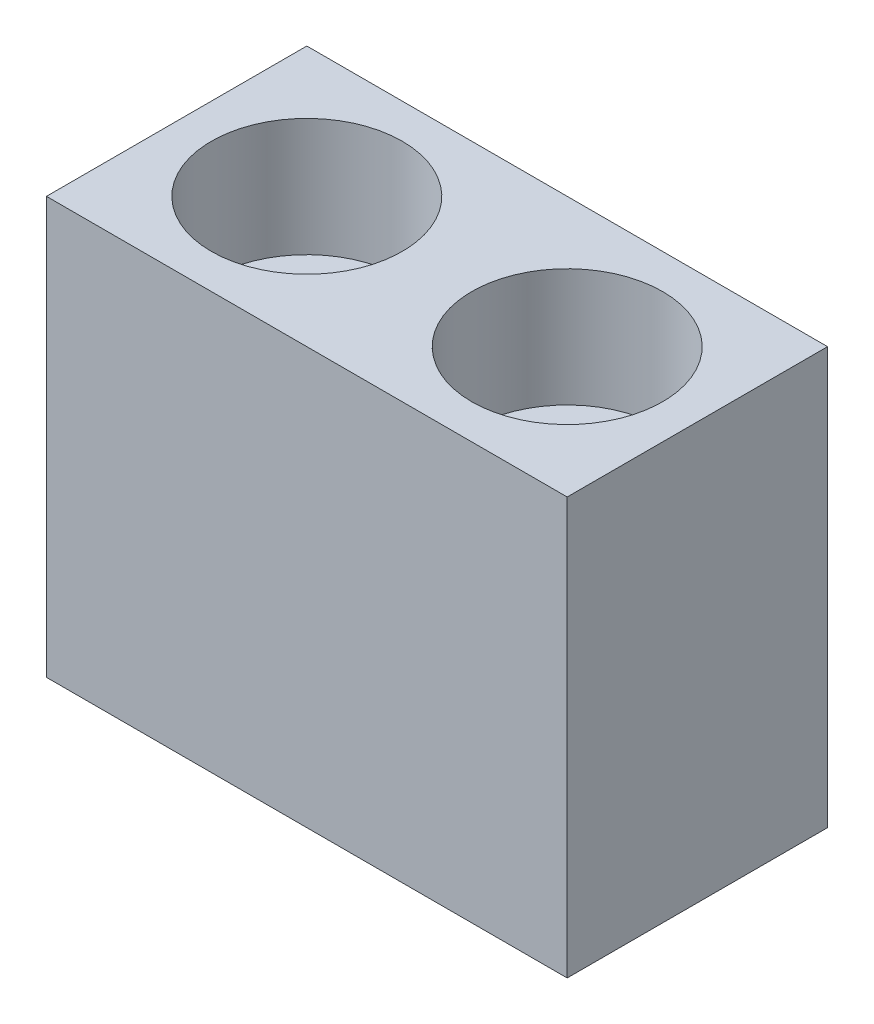
ISO-10303-21;
HEADER;
FILE_DESCRIPTION(('STEP AP214'),'2;1');
FILE_NAME('part.step','',(''),(''),'','','');
FILE_SCHEMA(('AUTOMOTIVE_DESIGN { 1 0 10303 214 1 1 1 1 }'));
ENDSEC;
DATA;
#1=APPLICATION_CONTEXT('core data for automotive mechanical design processes');
#2=APPLICATION_PROTOCOL_DEFINITION('international standard','automotive_design',2000,#1);
#3=PRODUCT_CONTEXT('',#1,'mechanical');
#4=PRODUCT('Part','Part','',(#3));
#5=PRODUCT_RELATED_PRODUCT_CATEGORY('part','',(#4));
#6=PRODUCT_DEFINITION_FORMATION('','',#4);
#7=PRODUCT_DEFINITION_CONTEXT('part definition',#1,'design');
#8=PRODUCT_DEFINITION('design','',#6,#7);
#9=PRODUCT_DEFINITION_SHAPE('','',#8);
#10=(LENGTH_UNIT() NAMED_UNIT(*) SI_UNIT(.MILLI.,.METRE.));
#11=(NAMED_UNIT(*) PLANE_ANGLE_UNIT() SI_UNIT($,.RADIAN.));
#12=(NAMED_UNIT(*) SI_UNIT($,.STERADIAN.) SOLID_ANGLE_UNIT());
#13=UNCERTAINTY_MEASURE_WITH_UNIT(LENGTH_MEASURE(1.E-05),#10,'distance_accuracy_value','');
#14=(GEOMETRIC_REPRESENTATION_CONTEXT(3) GLOBAL_UNCERTAINTY_ASSIGNED_CONTEXT((#13)) GLOBAL_UNIT_ASSIGNED_CONTEXT((#10,
#11,#12)) REPRESENTATION_CONTEXT('',''));
#15=CARTESIAN_POINT('',(0.,0.,0.));
#16=DIRECTION('',(0.,0.,1.));
#17=DIRECTION('',(1.,0.,0.));
#18=AXIS2_PLACEMENT_3D('',#15,#16,#17);
#19=CARTESIAN_POINT('',(15.,24.,7.5));
#20=DIRECTION('',(-1.,0.,0.));
#21=DIRECTION('',(0.,0.,1.));
#22=AXIS2_PLACEMENT_3D('',#19,#20,#21);
#23=PLANE('',#22);
#24=DIRECTION('',(0.,0.,-1.));
#25=VECTOR('',#24,1.);
#26=CARTESIAN_POINT('',(15.,0.,7.5));
#27=LINE('',#26,#25);
#28=CARTESIAN_POINT('',(15.,0.,7.5));
#29=VERTEX_POINT('',#28);
#30=CARTESIAN_POINT('',(15.,0.,-7.5));
#31=VERTEX_POINT('',#30);
#32=EDGE_CURVE('E98',#29,#31,#27,.T.);
#33=ORIENTED_EDGE('',*,*,#32,.T.);
#34=DIRECTION('',(0.,-1.,0.));
#35=VECTOR('',#34,1.);
#36=CARTESIAN_POINT('',(15.,24.,-7.5));
#37=LINE('',#36,#35);
#38=CARTESIAN_POINT('',(15.,24.,-7.5));
#39=VERTEX_POINT('',#38);
#40=EDGE_CURVE('E11',#39,#31,#37,.T.);
#41=ORIENTED_EDGE('',*,*,#40,.F.);
#42=DIRECTION('',(0.,0.,-1.));
#43=VECTOR('',#42,1.);
#44=CARTESIAN_POINT('',(15.,24.,7.5));
#45=LINE('',#44,#43);
#46=CARTESIAN_POINT('',(15.,24.,7.5));
#47=VERTEX_POINT('',#46);
#48=EDGE_CURVE('E86',#47,#39,#45,.T.);
#49=ORIENTED_EDGE('',*,*,#48,.F.);
#50=DIRECTION('',(0.,-1.,0.));
#51=VECTOR('',#50,1.);
#52=CARTESIAN_POINT('',(15.,24.,7.5));
#53=LINE('',#52,#51);
#54=EDGE_CURVE('E94',#47,#29,#53,.T.);
#55=ORIENTED_EDGE('',*,*,#54,.T.);
#56=EDGE_LOOP('',(#33,#41,#49,#55));
#57=FACE_BOUND('',#56,.T.);
#58=ADVANCED_FACE('F35',(#57),#23,.F.);
#59=CARTESIAN_POINT('',(-15.,24.,-7.5));
#60=DIRECTION('',(0.,0.,1.));
#61=DIRECTION('',(1.,0.,0.));
#62=AXIS2_PLACEMENT_3D('',#59,#60,#61);
#63=PLANE('',#62);
#64=DIRECTION('',(-1.,0.,0.));
#65=VECTOR('',#64,1.);
#66=CARTESIAN_POINT('',(-15.,0.,-7.5));
#67=LINE('',#66,#65);
#68=CARTESIAN_POINT('',(-15.,0.,-7.5));
#69=VERTEX_POINT('',#68);
#70=EDGE_CURVE('E90',#31,#69,#67,.T.);
#71=ORIENTED_EDGE('',*,*,#70,.T.);
#72=DIRECTION('',(0.,-1.,0.));
#73=VECTOR('',#72,1.);
#74=CARTESIAN_POINT('',(-15.,24.,-7.5));
#75=LINE('',#74,#73);
#76=CARTESIAN_POINT('',(-15.,24.,-7.5));
#77=VERTEX_POINT('',#76);
#78=EDGE_CURVE('E43',#77,#69,#75,.T.);
#79=ORIENTED_EDGE('',*,*,#78,.F.);
#80=DIRECTION('',(-1.,0.,0.));
#81=VECTOR('',#80,1.);
#82=CARTESIAN_POINT('',(-15.,24.,-7.5));
#83=LINE('',#82,#81);
#84=EDGE_CURVE('E81',#39,#77,#83,.T.);
#85=ORIENTED_EDGE('',*,*,#84,.F.);
#86=ORIENTED_EDGE('',*,*,#40,.T.);
#87=EDGE_LOOP('',(#71,#79,#85,#86));
#88=FACE_BOUND('',#87,.T.);
#89=ADVANCED_FACE('F89',(#88),#63,.F.);
#90=CARTESIAN_POINT('',(-15.,24.,7.5));
#91=DIRECTION('',(1.,0.,0.));
#92=DIRECTION('',(0.,0.,-1.));
#93=AXIS2_PLACEMENT_3D('',#90,#91,#92);
#94=PLANE('',#93);
#95=DIRECTION('',(0.,0.,1.));
#96=VECTOR('',#95,1.);
#97=CARTESIAN_POINT('',(-15.,0.,7.5));
#98=LINE('',#97,#96);
#99=CARTESIAN_POINT('',(-15.,0.,7.5));
#100=VERTEX_POINT('',#99);
#101=EDGE_CURVE('E68',#69,#100,#98,.T.);
#102=ORIENTED_EDGE('',*,*,#101,.T.);
#103=DIRECTION('',(0.,-1.,0.));
#104=VECTOR('',#103,1.);
#105=CARTESIAN_POINT('',(-15.,24.,7.5));
#106=LINE('',#105,#104);
#107=CARTESIAN_POINT('',(-15.,24.,7.5));
#108=VERTEX_POINT('',#107);
#109=EDGE_CURVE('E91',#108,#100,#106,.T.);
#110=ORIENTED_EDGE('',*,*,#109,.F.);
#111=DIRECTION('',(0.,0.,1.));
#112=VECTOR('',#111,1.);
#113=CARTESIAN_POINT('',(-15.,24.,7.5));
#114=LINE('',#113,#112);
#115=EDGE_CURVE('E84',#77,#108,#114,.T.);
#116=ORIENTED_EDGE('',*,*,#115,.F.);
#117=ORIENTED_EDGE('',*,*,#78,.T.);
#118=EDGE_LOOP('',(#102,#110,#116,#117));
#119=FACE_BOUND('',#118,.T.);
#120=ADVANCED_FACE('F92',(#119),#94,.F.);
#121=CARTESIAN_POINT('',(-15.,24.,7.5));
#122=DIRECTION('',(0.,0.,-1.));
#123=DIRECTION('',(-1.,0.,0.));
#124=AXIS2_PLACEMENT_3D('',#121,#122,#123);
#125=PLANE('',#124);
#126=DIRECTION('',(1.,0.,0.));
#127=VECTOR('',#126,1.);
#128=CARTESIAN_POINT('',(-15.,0.,7.5));
#129=LINE('',#128,#127);
#130=EDGE_CURVE('E74',#100,#29,#129,.T.);
#131=ORIENTED_EDGE('',*,*,#130,.T.);
#132=ORIENTED_EDGE('',*,*,#54,.F.);
#133=DIRECTION('',(1.,0.,0.));
#134=VECTOR('',#133,1.);
#135=CARTESIAN_POINT('',(-15.,24.,7.5));
#136=LINE('',#135,#134);
#137=EDGE_CURVE('E51',#108,#47,#136,.T.);
#138=ORIENTED_EDGE('',*,*,#137,.F.);
#139=ORIENTED_EDGE('',*,*,#109,.T.);
#140=EDGE_LOOP('',(#131,#132,#138,#139));
#141=FACE_BOUND('',#140,.T.);
#142=ADVANCED_FACE('F106',(#141),#125,.F.);
#143=CARTESIAN_POINT('',(0.,24.,0.));
#144=DIRECTION('',(0.,-1.,0.));
#145=DIRECTION('',(0.,0.,-1.));
#146=AXIS2_PLACEMENT_3D('',#143,#144,#145);
#147=PLANE('',#146);
#148=CARTESIAN_POINT('',(-7.5,24.,0.));
#149=DIRECTION('',(0.,1.,0.));
#150=DIRECTION('',(0.,0.,1.));
#151=AXIS2_PLACEMENT_3D('',#148,#149,#150);
#152=CIRCLE('',#151,5.5);
#153=CARTESIAN_POINT('',(-7.5,24.,5.5));
#154=VERTEX_POINT('',#153);
#155=EDGE_CURVE('E132',#154,#154,#152,.T.);
#156=ORIENTED_EDGE('',*,*,#155,.F.);
#157=EDGE_LOOP('',(#156));
#158=FACE_BOUND('',#157,.T.);
#159=CARTESIAN_POINT('',(7.5,24.,0.));
#160=DIRECTION('',(0.,1.,0.));
#161=DIRECTION('',(0.,0.,1.));
#162=AXIS2_PLACEMENT_3D('',#159,#160,#161);
#163=CIRCLE('',#162,5.5);
#164=CARTESIAN_POINT('',(7.5,24.,5.5));
#165=VERTEX_POINT('',#164);
#166=EDGE_CURVE('E120',#165,#165,#163,.T.);
#167=ORIENTED_EDGE('',*,*,#166,.F.);
#168=EDGE_LOOP('',(#167));
#169=FACE_BOUND('',#168,.T.);
#170=ORIENTED_EDGE('',*,*,#48,.T.);
#171=ORIENTED_EDGE('',*,*,#84,.T.);
#172=ORIENTED_EDGE('',*,*,#115,.T.);
#173=ORIENTED_EDGE('',*,*,#137,.T.);
#174=EDGE_LOOP('',(#170,#171,#172,#173));
#175=FACE_BOUND('',#174,.T.);
#176=ADVANCED_FACE('F82',(#158,#169,#175),#147,.F.);
#177=CARTESIAN_POINT('',(0.,0.,0.));
#178=DIRECTION('',(0.,-1.,0.));
#179=DIRECTION('',(0.,0.,-1.));
#180=AXIS2_PLACEMENT_3D('',#177,#178,#179);
#181=PLANE('',#180);
#182=CARTESIAN_POINT('',(-7.5,0.,0.));
#183=DIRECTION('',(0.,1.,0.));
#184=DIRECTION('',(0.,0.,1.));
#185=AXIS2_PLACEMENT_3D('',#182,#183,#184);
#186=CIRCLE('',#185,3.29999999999999);
#187=CARTESIAN_POINT('',(-7.5,0.,3.29999999999999));
#188=VERTEX_POINT('',#187);
#189=EDGE_CURVE('E123',#188,#188,#186,.T.);
#190=ORIENTED_EDGE('',*,*,#189,.T.);
#191=EDGE_LOOP('',(#190));
#192=FACE_BOUND('',#191,.T.);
#193=CARTESIAN_POINT('',(7.5,0.,0.));
#194=DIRECTION('',(0.,1.,0.));
#195=DIRECTION('',(0.,0.,1.));
#196=AXIS2_PLACEMENT_3D('',#193,#194,#195);
#197=CIRCLE('',#196,3.29999999999999);
#198=CARTESIAN_POINT('',(7.5,0.,3.29999999999999));
#199=VERTEX_POINT('',#198);
#200=EDGE_CURVE('E101',#199,#199,#197,.T.);
#201=ORIENTED_EDGE('',*,*,#200,.T.);
#202=EDGE_LOOP('',(#201));
#203=FACE_BOUND('',#202,.T.);
#204=ORIENTED_EDGE('',*,*,#32,.F.);
#205=ORIENTED_EDGE('',*,*,#130,.F.);
#206=ORIENTED_EDGE('',*,*,#101,.F.);
#207=ORIENTED_EDGE('',*,*,#70,.F.);
#208=EDGE_LOOP('',(#204,#205,#206,#207));
#209=FACE_BOUND('',#208,.T.);
#210=ADVANCED_FACE('F109',(#192,#203,#209),#181,.T.);
#211=CARTESIAN_POINT('',(7.5,24.,0.));
#212=DIRECTION('',(0.,1.,0.));
#213=DIRECTION('',(0.,0.,1.));
#214=AXIS2_PLACEMENT_3D('',#211,#212,#213);
#215=CYLINDRICAL_SURFACE('',#214,3.3);
#216=ORIENTED_EDGE('',*,*,#200,.F.);
#217=EDGE_LOOP('',(#216));
#218=FACE_BOUND('',#217,.T.);
#219=CARTESIAN_POINT('',(7.5,17.2,0.));
#220=DIRECTION('',(0.,1.,0.));
#221=DIRECTION('',(0.,0.,1.));
#222=AXIS2_PLACEMENT_3D('',#219,#220,#221);
#223=CIRCLE('',#222,3.3);
#224=CARTESIAN_POINT('',(7.5,17.2,3.3));
#225=VERTEX_POINT('',#224);
#226=EDGE_CURVE('E114',#225,#225,#223,.T.);
#227=ORIENTED_EDGE('',*,*,#226,.T.);
#228=EDGE_LOOP('',(#227));
#229=FACE_BOUND('',#228,.T.);
#230=ADVANCED_FACE('F156',(#218,#229),#215,.F.);
#231=CARTESIAN_POINT('',(10.8,17.2,0.));
#232=DIRECTION('',(0.,-1.,0.));
#233=DIRECTION('',(0.,0.,-1.));
#234=AXIS2_PLACEMENT_3D('',#231,#232,#233);
#235=PLANE('',#234);
#236=ORIENTED_EDGE('',*,*,#226,.F.);
#237=EDGE_LOOP('',(#236));
#238=FACE_BOUND('',#237,.T.);
#239=CARTESIAN_POINT('',(7.5,17.2,0.));
#240=DIRECTION('',(0.,1.,0.));
#241=DIRECTION('',(0.,0.,1.));
#242=AXIS2_PLACEMENT_3D('',#239,#240,#241);
#243=CIRCLE('',#242,5.5);
#244=CARTESIAN_POINT('',(7.5,17.2,5.5));
#245=VERTEX_POINT('',#244);
#246=EDGE_CURVE('E117',#245,#245,#243,.T.);
#247=ORIENTED_EDGE('',*,*,#246,.T.);
#248=EDGE_LOOP('',(#247));
#249=FACE_BOUND('',#248,.T.);
#250=ADVANCED_FACE('F146',(#238,#249),#235,.F.);
#251=CARTESIAN_POINT('',(7.5,24.,0.));
#252=DIRECTION('',(0.,1.,0.));
#253=DIRECTION('',(0.,0.,1.));
#254=AXIS2_PLACEMENT_3D('',#251,#252,#253);
#255=CYLINDRICAL_SURFACE('',#254,5.5);
#256=ORIENTED_EDGE('',*,*,#246,.F.);
#257=EDGE_LOOP('',(#256));
#258=FACE_BOUND('',#257,.T.);
#259=ORIENTED_EDGE('',*,*,#166,.T.);
#260=EDGE_LOOP('',(#259));
#261=FACE_BOUND('',#260,.T.);
#262=ADVANCED_FACE('F143',(#258,#261),#255,.F.);
#263=CARTESIAN_POINT('',(-7.5,24.,0.));
#264=DIRECTION('',(0.,1.,0.));
#265=DIRECTION('',(0.,0.,1.));
#266=AXIS2_PLACEMENT_3D('',#263,#264,#265);
#267=CYLINDRICAL_SURFACE('',#266,3.3);
#268=ORIENTED_EDGE('',*,*,#189,.F.);
#269=EDGE_LOOP('',(#268));
#270=FACE_BOUND('',#269,.T.);
#271=CARTESIAN_POINT('',(-7.5,17.2,0.));
#272=DIRECTION('',(0.,1.,0.));
#273=DIRECTION('',(0.,0.,1.));
#274=AXIS2_PLACEMENT_3D('',#271,#272,#273);
#275=CIRCLE('',#274,3.3);
#276=CARTESIAN_POINT('',(-7.5,17.2,3.3));
#277=VERTEX_POINT('',#276);
#278=EDGE_CURVE('E126',#277,#277,#275,.T.);
#279=ORIENTED_EDGE('',*,*,#278,.T.);
#280=EDGE_LOOP('',(#279));
#281=FACE_BOUND('',#280,.T.);
#282=ADVANCED_FACE('F145',(#270,#281),#267,.F.);
#283=CARTESIAN_POINT('',(-4.2,17.2,0.));
#284=DIRECTION('',(0.,-1.,0.));
#285=DIRECTION('',(0.,0.,-1.));
#286=AXIS2_PLACEMENT_3D('',#283,#284,#285);
#287=PLANE('',#286);
#288=ORIENTED_EDGE('',*,*,#278,.F.);
#289=EDGE_LOOP('',(#288));
#290=FACE_BOUND('',#289,.T.);
#291=CARTESIAN_POINT('',(-7.5,17.2,0.));
#292=DIRECTION('',(0.,1.,0.));
#293=DIRECTION('',(0.,0.,1.));
#294=AXIS2_PLACEMENT_3D('',#291,#292,#293);
#295=CIRCLE('',#294,5.5);
#296=CARTESIAN_POINT('',(-7.5,17.2,5.5));
#297=VERTEX_POINT('',#296);
#298=EDGE_CURVE('E129',#297,#297,#295,.T.);
#299=ORIENTED_EDGE('',*,*,#298,.T.);
#300=EDGE_LOOP('',(#299));
#301=FACE_BOUND('',#300,.T.);
#302=ADVANCED_FACE('F153',(#290,#301),#287,.F.);
#303=CARTESIAN_POINT('',(-7.5,24.,0.));
#304=DIRECTION('',(0.,1.,0.));
#305=DIRECTION('',(0.,0.,1.));
#306=AXIS2_PLACEMENT_3D('',#303,#304,#305);
#307=CYLINDRICAL_SURFACE('',#306,5.5);
#308=ORIENTED_EDGE('',*,*,#298,.F.);
#309=EDGE_LOOP('',(#308));
#310=FACE_BOUND('',#309,.T.);
#311=ORIENTED_EDGE('',*,*,#155,.T.);
#312=EDGE_LOOP('',(#311));
#313=FACE_BOUND('',#312,.T.);
#314=ADVANCED_FACE('F136',(#310,#313),#307,.F.);
#315=CLOSED_SHELL('',(#58,#89,#120,#142,#176,#210,#230,#250,#262,#282,#302,#314));
#316=MANIFOLD_SOLID_BREP('B2',#315);
#317=ADVANCED_BREP_SHAPE_REPRESENTATION('',(#18,#316),#14);
#318=SHAPE_DEFINITION_REPRESENTATION(#9,#317);
ENDSEC;
END-ISO-10303-21;
